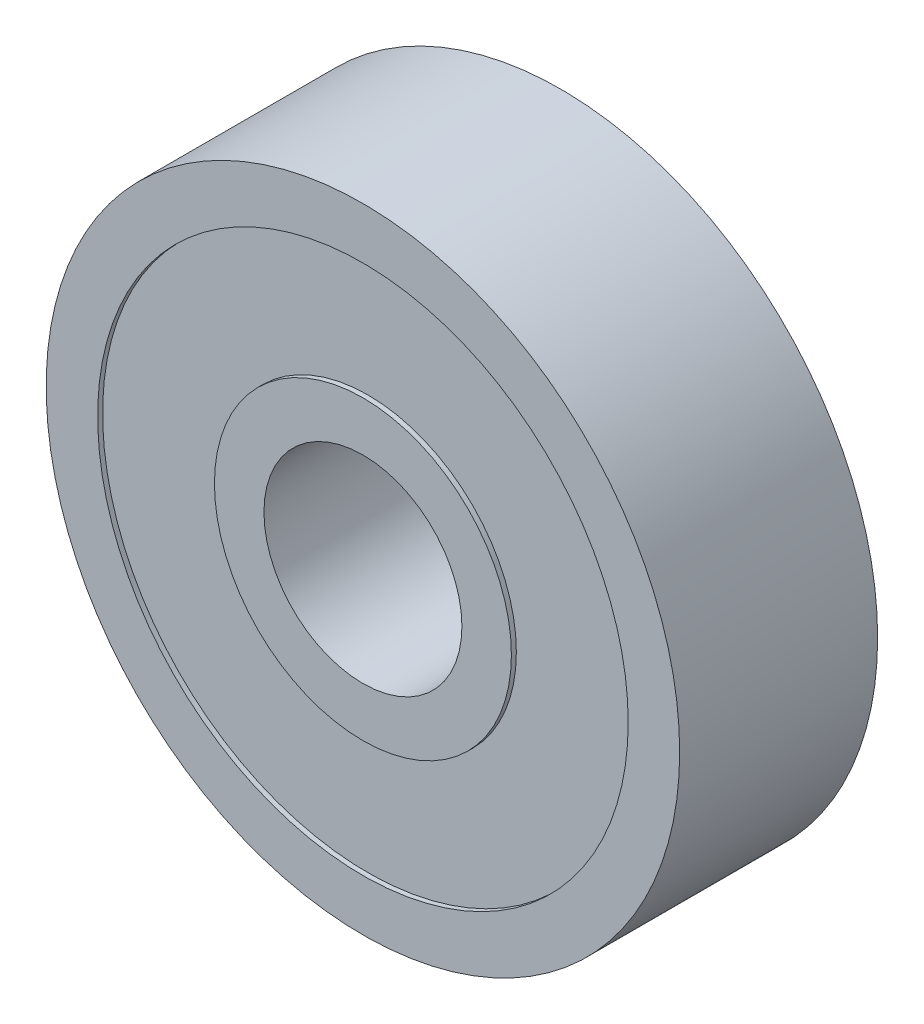
ISO-10303-21;
HEADER;
FILE_DESCRIPTION(('STEP AP214'),'2;1');
FILE_NAME('part.step','',(''),(''),'','','');
FILE_SCHEMA(('AUTOMOTIVE_DESIGN { 1 0 10303 214 1 1 1 1 }'));
ENDSEC;
DATA;
#1=APPLICATION_CONTEXT('core data for automotive mechanical design processes');
#2=APPLICATION_PROTOCOL_DEFINITION('international standard','automotive_design',2000,#1);
#3=PRODUCT_CONTEXT('',#1,'mechanical');
#4=PRODUCT('Part','Part','',(#3));
#5=PRODUCT_RELATED_PRODUCT_CATEGORY('part','',(#4));
#6=PRODUCT_DEFINITION_FORMATION('','',#4);
#7=PRODUCT_DEFINITION_CONTEXT('part definition',#1,'design');
#8=PRODUCT_DEFINITION('design','',#6,#7);
#9=PRODUCT_DEFINITION_SHAPE('','',#8);
#10=(LENGTH_UNIT() NAMED_UNIT(*) SI_UNIT(.MILLI.,.METRE.));
#11=(NAMED_UNIT(*) PLANE_ANGLE_UNIT() SI_UNIT($,.RADIAN.));
#12=(NAMED_UNIT(*) SI_UNIT($,.STERADIAN.) SOLID_ANGLE_UNIT());
#13=UNCERTAINTY_MEASURE_WITH_UNIT(LENGTH_MEASURE(1.E-05),#10,'distance_accuracy_value','');
#14=(GEOMETRIC_REPRESENTATION_CONTEXT(3) GLOBAL_UNCERTAINTY_ASSIGNED_CONTEXT((#13)) GLOBAL_UNIT_ASSIGNED_CONTEXT((#10,
#11,#12)) REPRESENTATION_CONTEXT('',''));
#15=CARTESIAN_POINT('',(0.,0.,0.));
#16=DIRECTION('',(0.,0.,1.));
#17=DIRECTION('',(1.,0.,0.));
#18=AXIS2_PLACEMENT_3D('',#15,#16,#17);
#19=CARTESIAN_POINT('',(0.,0.,2.5));
#20=DIRECTION('',(0.,0.,-1.));
#21=DIRECTION('',(1.,0.,0.));
#22=AXIS2_PLACEMENT_3D('',#19,#20,#21);
#23=CYLINDRICAL_SURFACE('',#22,3.75);
#24=CARTESIAN_POINT('',(0.,0.,2.5));
#25=DIRECTION('',(0.,0.,1.));
#26=DIRECTION('',(1.,0.,0.));
#27=AXIS2_PLACEMENT_3D('',#24,#25,#26);
#28=CIRCLE('',#27,3.75);
#29=CARTESIAN_POINT('',(3.75,0.,2.5));
#30=VERTEX_POINT('',#29);
#31=EDGE_CURVE('E46',#30,#30,#28,.T.);
#32=ORIENTED_EDGE('',*,*,#31,.F.);
#33=EDGE_LOOP('',(#32));
#34=FACE_BOUND('',#33,.T.);
#35=CARTESIAN_POINT('',(0.,0.,2.375));
#36=DIRECTION('',(0.,0.,1.));
#37=DIRECTION('',(1.,0.,0.));
#38=AXIS2_PLACEMENT_3D('',#35,#36,#37);
#39=CIRCLE('',#38,3.75);
#40=CARTESIAN_POINT('',(3.75,0.,2.375));
#41=VERTEX_POINT('',#40);
#42=EDGE_CURVE('E65',#41,#41,#39,.T.);
#43=ORIENTED_EDGE('',*,*,#42,.T.);
#44=EDGE_LOOP('',(#43));
#45=FACE_BOUND('',#44,.T.);
#46=ADVANCED_FACE('F39',(#34,#45),#23,.T.);
#47=CARTESIAN_POINT('',(0.,0.,2.5));
#48=DIRECTION('',(0.,0.,-1.));
#49=DIRECTION('',(1.,0.,0.));
#50=AXIS2_PLACEMENT_3D('',#47,#48,#49);
#51=CYLINDRICAL_SURFACE('',#50,2.5);
#52=CARTESIAN_POINT('',(0.,0.,2.5));
#53=DIRECTION('',(0.,0.,1.));
#54=DIRECTION('',(1.,0.,0.));
#55=AXIS2_PLACEMENT_3D('',#52,#53,#54);
#56=CIRCLE('',#55,2.5);
#57=CARTESIAN_POINT('',(2.5,0.,2.5));
#58=VERTEX_POINT('',#57);
#59=EDGE_CURVE('E50',#58,#58,#56,.T.);
#60=ORIENTED_EDGE('',*,*,#59,.T.);
#61=EDGE_LOOP('',(#60));
#62=FACE_BOUND('',#61,.T.);
#63=CARTESIAN_POINT('',(0.,0.,-2.5));
#64=DIRECTION('',(0.,0.,1.));
#65=DIRECTION('',(1.,0.,0.));
#66=AXIS2_PLACEMENT_3D('',#63,#64,#65);
#67=CIRCLE('',#66,2.5);
#68=CARTESIAN_POINT('',(2.5,0.,-2.5));
#69=VERTEX_POINT('',#68);
#70=EDGE_CURVE('E59',#69,#69,#67,.T.);
#71=ORIENTED_EDGE('',*,*,#70,.F.);
#72=EDGE_LOOP('',(#71));
#73=FACE_BOUND('',#72,.T.);
#74=ADVANCED_FACE('F41',(#62,#73),#51,.F.);
#75=CARTESIAN_POINT('',(0.,0.,-2.375));
#76=DIRECTION('',(0.,0.,1.));
#77=DIRECTION('',(1.,0.,0.));
#78=AXIS2_PLACEMENT_3D('',#75,#76,#77);
#79=CIRCLE('',#78,3.75);
#80=CARTESIAN_POINT('',(3.75,0.,-2.375));
#81=VERTEX_POINT('',#80);
#82=EDGE_CURVE('E10',#81,#81,#79,.F.);
#83=ORIENTED_EDGE('',*,*,#82,.T.);
#84=EDGE_LOOP('',(#83));
#85=FACE_BOUND('',#84,.T.);
#86=CARTESIAN_POINT('',(0.,0.,-2.5));
#87=DIRECTION('',(0.,0.,1.));
#88=DIRECTION('',(1.,0.,0.));
#89=AXIS2_PLACEMENT_3D('',#86,#87,#88);
#90=CIRCLE('',#89,3.75);
#91=CARTESIAN_POINT('',(3.75,0.,-2.5));
#92=VERTEX_POINT('',#91);
#93=EDGE_CURVE('E54',#92,#92,#90,.T.);
#94=ORIENTED_EDGE('',*,*,#93,.T.);
#95=EDGE_LOOP('',(#94));
#96=FACE_BOUND('',#95,.T.);
#97=ADVANCED_FACE('F105',(#85,#96),#23,.T.);
#98=CARTESIAN_POINT('',(0.,0.,2.5));
#99=DIRECTION('',(0.,0.,-1.));
#100=DIRECTION('',(1.,0.,0.));
#101=AXIS2_PLACEMENT_3D('',#98,#99,#100);
#102=PLANE('',#101);
#103=ORIENTED_EDGE('',*,*,#59,.F.);
#104=EDGE_LOOP('',(#103));
#105=FACE_BOUND('',#104,.T.);
#106=ORIENTED_EDGE('',*,*,#31,.T.);
#107=EDGE_LOOP('',(#106));
#108=FACE_BOUND('',#107,.T.);
#109=ADVANCED_FACE('F113',(#105,#108),#102,.F.);
#110=CARTESIAN_POINT('',(0.,0.,-2.5));
#111=DIRECTION('',(0.,0.,-1.));
#112=DIRECTION('',(1.,0.,0.));
#113=AXIS2_PLACEMENT_3D('',#110,#111,#112);
#114=PLANE('',#113);
#115=ORIENTED_EDGE('',*,*,#70,.T.);
#116=EDGE_LOOP('',(#115));
#117=FACE_BOUND('',#116,.T.);
#118=ORIENTED_EDGE('',*,*,#93,.F.);
#119=EDGE_LOOP('',(#118));
#120=FACE_BOUND('',#119,.T.);
#121=ADVANCED_FACE('F117',(#117,#120),#114,.T.);
#122=CARTESIAN_POINT('',(0.,0.,2.375));
#123=DIRECTION('',(0.,0.,-1.));
#124=DIRECTION('',(1.,0.,0.));
#125=AXIS2_PLACEMENT_3D('',#122,#123,#124);
#126=PLANE('',#125);
#127=ORIENTED_EDGE('',*,*,#42,.F.);
#128=EDGE_LOOP('',(#127));
#129=FACE_BOUND('',#128,.T.);
#130=CARTESIAN_POINT('',(0.,0.,2.375));
#131=DIRECTION('',(0.,0.,1.));
#132=DIRECTION('',(1.,0.,0.));
#133=AXIS2_PLACEMENT_3D('',#130,#131,#132);
#134=CIRCLE('',#133,6.7);
#135=CARTESIAN_POINT('',(6.7,0.,2.375));
#136=VERTEX_POINT('',#135);
#137=EDGE_CURVE('E62',#136,#136,#134,.T.);
#138=ORIENTED_EDGE('',*,*,#137,.T.);
#139=EDGE_LOOP('',(#138));
#140=FACE_BOUND('',#139,.T.);
#141=ADVANCED_FACE('F123',(#129,#140),#126,.F.);
#142=CARTESIAN_POINT('',(0.,0.,-2.375));
#143=DIRECTION('',(0.,0.,-1.));
#144=DIRECTION('',(1.,0.,0.));
#145=AXIS2_PLACEMENT_3D('',#142,#143,#144);
#146=PLANE('',#145);
#147=ORIENTED_EDGE('',*,*,#82,.F.);
#148=EDGE_LOOP('',(#147));
#149=FACE_BOUND('',#148,.T.);
#150=CARTESIAN_POINT('',(0.,0.,-2.375));
#151=DIRECTION('',(0.,0.,1.));
#152=DIRECTION('',(1.,0.,0.));
#153=AXIS2_PLACEMENT_3D('',#150,#151,#152);
#154=CIRCLE('',#153,6.7);
#155=CARTESIAN_POINT('',(6.7,0.,-2.375));
#156=VERTEX_POINT('',#155);
#157=EDGE_CURVE('E68',#156,#156,#154,.T.);
#158=ORIENTED_EDGE('',*,*,#157,.F.);
#159=EDGE_LOOP('',(#158));
#160=FACE_BOUND('',#159,.T.);
#161=ADVANCED_FACE('F100',(#149,#160),#146,.T.);
#162=CARTESIAN_POINT('',(0.,0.,2.5));
#163=DIRECTION('',(0.,0.,-1.));
#164=DIRECTION('',(1.,0.,0.));
#165=AXIS2_PLACEMENT_3D('',#162,#163,#164);
#166=CYLINDRICAL_SURFACE('',#165,6.7);
#167=CARTESIAN_POINT('',(0.,0.,2.5));
#168=DIRECTION('',(0.,0.,1.));
#169=DIRECTION('',(1.,0.,0.));
#170=AXIS2_PLACEMENT_3D('',#167,#168,#169);
#171=CIRCLE('',#170,6.7);
#172=CARTESIAN_POINT('',(6.7,0.,2.5));
#173=VERTEX_POINT('',#172);
#174=EDGE_CURVE('E74',#173,#173,#171,.T.);
#175=ORIENTED_EDGE('',*,*,#174,.T.);
#176=EDGE_LOOP('',(#175));
#177=FACE_BOUND('',#176,.T.);
#178=ORIENTED_EDGE('',*,*,#137,.F.);
#179=EDGE_LOOP('',(#178));
#180=FACE_BOUND('',#179,.T.);
#181=ADVANCED_FACE('F90',(#177,#180),#166,.F.);
#182=ORIENTED_EDGE('',*,*,#157,.T.);
#183=EDGE_LOOP('',(#182));
#184=FACE_BOUND('',#183,.T.);
#185=CARTESIAN_POINT('',(0.,0.,-2.5));
#186=DIRECTION('',(0.,0.,1.));
#187=DIRECTION('',(1.,0.,0.));
#188=AXIS2_PLACEMENT_3D('',#185,#186,#187);
#189=CIRCLE('',#188,6.7);
#190=CARTESIAN_POINT('',(6.7,0.,-2.5));
#191=VERTEX_POINT('',#190);
#192=EDGE_CURVE('E80',#191,#191,#189,.T.);
#193=ORIENTED_EDGE('',*,*,#192,.F.);
#194=EDGE_LOOP('',(#193));
#195=FACE_BOUND('',#194,.T.);
#196=ADVANCED_FACE('F87',(#184,#195),#166,.F.);
#197=CARTESIAN_POINT('',(0.,0.,2.5));
#198=DIRECTION('',(0.,0.,-1.));
#199=DIRECTION('',(1.,0.,0.));
#200=AXIS2_PLACEMENT_3D('',#197,#198,#199);
#201=CYLINDRICAL_SURFACE('',#200,8.);
#202=CARTESIAN_POINT('',(0.,0.,2.5));
#203=DIRECTION('',(0.,0.,1.));
#204=DIRECTION('',(1.,0.,0.));
#205=AXIS2_PLACEMENT_3D('',#202,#203,#204);
#206=CIRCLE('',#205,8.);
#207=CARTESIAN_POINT('',(8.,0.,2.5));
#208=VERTEX_POINT('',#207);
#209=EDGE_CURVE('E71',#208,#208,#206,.T.);
#210=ORIENTED_EDGE('',*,*,#209,.F.);
#211=EDGE_LOOP('',(#210));
#212=FACE_BOUND('',#211,.T.);
#213=CARTESIAN_POINT('',(0.,0.,-2.5));
#214=DIRECTION('',(0.,0.,1.));
#215=DIRECTION('',(1.,0.,0.));
#216=AXIS2_PLACEMENT_3D('',#213,#214,#215);
#217=CIRCLE('',#216,8.);
#218=CARTESIAN_POINT('',(8.,0.,-2.5));
#219=VERTEX_POINT('',#218);
#220=EDGE_CURVE('E77',#219,#219,#217,.T.);
#221=ORIENTED_EDGE('',*,*,#220,.T.);
#222=EDGE_LOOP('',(#221));
#223=FACE_BOUND('',#222,.T.);
#224=ADVANCED_FACE('F89',(#212,#223),#201,.T.);
#225=CARTESIAN_POINT('',(0.,0.,2.5));
#226=DIRECTION('',(0.,0.,-1.));
#227=DIRECTION('',(1.,0.,0.));
#228=AXIS2_PLACEMENT_3D('',#225,#226,#227);
#229=PLANE('',#228);
#230=ORIENTED_EDGE('',*,*,#174,.F.);
#231=EDGE_LOOP('',(#230));
#232=FACE_BOUND('',#231,.T.);
#233=ORIENTED_EDGE('',*,*,#209,.T.);
#234=EDGE_LOOP('',(#233));
#235=FACE_BOUND('',#234,.T.);
#236=ADVANCED_FACE('F97',(#232,#235),#229,.F.);
#237=CARTESIAN_POINT('',(0.,0.,-2.5));
#238=DIRECTION('',(0.,0.,-1.));
#239=DIRECTION('',(1.,0.,0.));
#240=AXIS2_PLACEMENT_3D('',#237,#238,#239);
#241=PLANE('',#240);
#242=ORIENTED_EDGE('',*,*,#192,.T.);
#243=EDGE_LOOP('',(#242));
#244=FACE_BOUND('',#243,.T.);
#245=ORIENTED_EDGE('',*,*,#220,.F.);
#246=EDGE_LOOP('',(#245));
#247=FACE_BOUND('',#246,.T.);
#248=ADVANCED_FACE('F84',(#244,#247),#241,.T.);
#249=CLOSED_SHELL('',(#46,#74,#97,#109,#121,#141,#161,#181,#196,#224,#236,#248));
#250=MANIFOLD_SOLID_BREP('B2',#249);
#251=ADVANCED_BREP_SHAPE_REPRESENTATION('',(#18,#250),#14);
#252=SHAPE_DEFINITION_REPRESENTATION(#9,#251);
ENDSEC;
END-ISO-10303-21;
